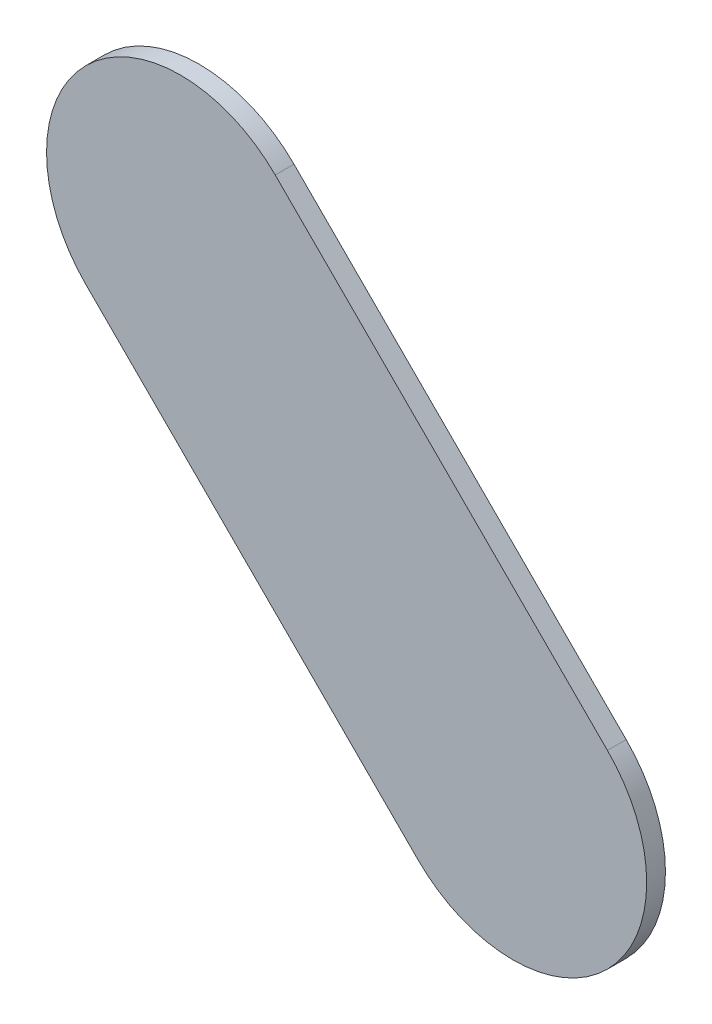
ISO-10303-21;
HEADER;
FILE_DESCRIPTION(('STEP AP214'),'2;1');
FILE_NAME('part.step','',(''),(''),'','','');
FILE_SCHEMA(('AUTOMOTIVE_DESIGN { 1 0 10303 214 1 1 1 1 }'));
ENDSEC;
DATA;
#1=APPLICATION_CONTEXT('core data for automotive mechanical design processes');
#2=APPLICATION_PROTOCOL_DEFINITION('international standard','automotive_design',2000,#1);
#3=PRODUCT_CONTEXT('',#1,'mechanical');
#4=PRODUCT('Part','Part','',(#3));
#5=PRODUCT_RELATED_PRODUCT_CATEGORY('part','',(#4));
#6=PRODUCT_DEFINITION_FORMATION('','',#4);
#7=PRODUCT_DEFINITION_CONTEXT('part definition',#1,'design');
#8=PRODUCT_DEFINITION('design','',#6,#7);
#9=PRODUCT_DEFINITION_SHAPE('','',#8);
#10=(LENGTH_UNIT() NAMED_UNIT(*) SI_UNIT(.MILLI.,.METRE.));
#11=(NAMED_UNIT(*) PLANE_ANGLE_UNIT() SI_UNIT($,.RADIAN.));
#12=(NAMED_UNIT(*) SI_UNIT($,.STERADIAN.) SOLID_ANGLE_UNIT());
#13=UNCERTAINTY_MEASURE_WITH_UNIT(LENGTH_MEASURE(1.E-05),#10,'distance_accuracy_value','');
#14=(GEOMETRIC_REPRESENTATION_CONTEXT(3) GLOBAL_UNCERTAINTY_ASSIGNED_CONTEXT((#13)) GLOBAL_UNIT_ASSIGNED_CONTEXT((#10,
#11,#12)) REPRESENTATION_CONTEXT('',''));
#15=CARTESIAN_POINT('',(0.,0.,0.));
#16=DIRECTION('',(0.,0.,1.));
#17=DIRECTION('',(1.,0.,0.));
#18=AXIS2_PLACEMENT_3D('',#15,#16,#17);
#19=CARTESIAN_POINT('',(78.866776,-110.573223,1.635));
#20=DIRECTION('',(0.,0.,1.));
#21=DIRECTION('',(1.,0.,0.));
#22=AXIS2_PLACEMENT_3D('',#19,#20,#21);
#23=PLANE('',#22);
#24=DIRECTION('',(-0.707106781186548,0.707106781186548,0.));
#25=VECTOR('',#24,1.);
#26=CARTESIAN_POINT('',(78.866776,-110.573223,1.635));
#27=LINE('',#26,#25);
#28=CARTESIAN_POINT('',(78.866776,-110.573223,1.635));
#29=VERTEX_POINT('',#28);
#30=CARTESIAN_POINT('',(78.246776,-109.953223,1.635));
#31=VERTEX_POINT('',#30);
#32=EDGE_CURVE('E82',#29,#31,#27,.T.);
#33=ORIENTED_EDGE('',*,*,#32,.T.);
#34=CARTESIAN_POINT('',(78.0699995,-110.1299995,1.635));
#35=DIRECTION('',(0.,0.,1.));
#36=DIRECTION('',(0.707106781186548,0.707106781186548,0.));
#37=AXIS2_PLACEMENT_3D('',#34,#35,#36);
#38=CIRCLE('',#37,0.249999723809);
#39=CARTESIAN_POINT('',(77.893223,-110.306776,1.635));
#40=VERTEX_POINT('',#39);
#41=EDGE_CURVE('E100',#31,#40,#38,.T.);
#42=ORIENTED_EDGE('',*,*,#41,.T.);
#43=DIRECTION('',(0.707106781186548,-0.707106781186548,0.));
#44=VECTOR('',#43,1.);
#45=CARTESIAN_POINT('',(77.893223,-110.306776,1.635));
#46=LINE('',#45,#44);
#47=CARTESIAN_POINT('',(78.513223,-110.926776,1.635));
#48=VERTEX_POINT('',#47);
#49=EDGE_CURVE('E74',#40,#48,#46,.T.);
#50=ORIENTED_EDGE('',*,*,#49,.T.);
#51=CARTESIAN_POINT('',(78.6899995,-110.7499995,1.635));
#52=DIRECTION('',(0.,0.,1.));
#53=DIRECTION('',(-0.707106781186548,-0.707106781186548,0.));
#54=AXIS2_PLACEMENT_3D('',#51,#52,#53);
#55=CIRCLE('',#54,0.249999723809);
#56=EDGE_CURVE('E11',#48,#29,#55,.T.);
#57=ORIENTED_EDGE('',*,*,#56,.T.);
#58=EDGE_LOOP('',(#33,#42,#50,#57));
#59=FACE_BOUND('',#58,.T.);
#60=ADVANCED_FACE('F17',(#59),#23,.T.);
#61=CARTESIAN_POINT('',(78.866776,-110.573223,1.6));
#62=DIRECTION('',(0.,0.,1.));
#63=DIRECTION('',(1.,0.,0.));
#64=AXIS2_PLACEMENT_3D('',#61,#62,#63);
#65=PLANE('',#64);
#66=CARTESIAN_POINT('',(78.6899995,-110.7499995,1.6));
#67=DIRECTION('',(0.,0.,1.));
#68=DIRECTION('',(-0.707106781186548,-0.707106781186548,0.));
#69=AXIS2_PLACEMENT_3D('',#66,#67,#68);
#70=CIRCLE('',#69,0.249999723809);
#71=CARTESIAN_POINT('',(78.513223,-110.926776,1.6));
#72=VERTEX_POINT('',#71);
#73=CARTESIAN_POINT('',(78.866776,-110.573223,1.6));
#74=VERTEX_POINT('',#73);
#75=EDGE_CURVE('E25',#72,#74,#70,.T.);
#76=ORIENTED_EDGE('',*,*,#75,.F.);
#77=DIRECTION('',(0.707106781186548,-0.707106781186548,0.));
#78=VECTOR('',#77,1.);
#79=CARTESIAN_POINT('',(77.893223,-110.306776,1.6));
#80=LINE('',#79,#78);
#81=CARTESIAN_POINT('',(77.893223,-110.306776,1.6));
#82=VERTEX_POINT('',#81);
#83=EDGE_CURVE('E104',#82,#72,#80,.T.);
#84=ORIENTED_EDGE('',*,*,#83,.F.);
#85=CARTESIAN_POINT('',(78.0699995,-110.1299995,1.6));
#86=DIRECTION('',(0.,0.,1.));
#87=DIRECTION('',(0.707106781186548,0.707106781186548,0.));
#88=AXIS2_PLACEMENT_3D('',#85,#86,#87);
#89=CIRCLE('',#88,0.249999723809);
#90=CARTESIAN_POINT('',(78.246776,-109.953223,1.6));
#91=VERTEX_POINT('',#90);
#92=EDGE_CURVE('E84',#91,#82,#89,.T.);
#93=ORIENTED_EDGE('',*,*,#92,.F.);
#94=DIRECTION('',(-0.707106781186548,0.707106781186548,0.));
#95=VECTOR('',#94,1.);
#96=CARTESIAN_POINT('',(78.866776,-110.573223,1.6));
#97=LINE('',#96,#95);
#98=EDGE_CURVE('E80',#74,#91,#97,.T.);
#99=ORIENTED_EDGE('',*,*,#98,.F.);
#100=EDGE_LOOP('',(#76,#84,#93,#99));
#101=FACE_BOUND('',#100,.T.);
#102=ADVANCED_FACE('F86',(#101),#65,.F.);
#103=CARTESIAN_POINT('',(78.6899995,-110.7499995,1.6));
#104=DIRECTION('',(0.,0.,-1.));
#105=DIRECTION('',(-0.707106781186548,-0.707106781186548,0.));
#106=AXIS2_PLACEMENT_3D('',#103,#104,#105);
#107=CYLINDRICAL_SURFACE('',#106,0.249999723809);
#108=ORIENTED_EDGE('',*,*,#75,.T.);
#109=DIRECTION('',(0.,0.,1.));
#110=VECTOR('',#109,1.);
#111=CARTESIAN_POINT('',(78.866776,-110.573223,1.6));
#112=LINE('',#111,#110);
#113=EDGE_CURVE('E68',#74,#29,#112,.T.);
#114=ORIENTED_EDGE('',*,*,#113,.T.);
#115=ORIENTED_EDGE('',*,*,#56,.F.);
#116=DIRECTION('',(0.,0.,1.));
#117=VECTOR('',#116,1.);
#118=CARTESIAN_POINT('',(78.513223,-110.926776,1.6));
#119=LINE('',#118,#117);
#120=EDGE_CURVE('E71',#72,#48,#119,.T.);
#121=ORIENTED_EDGE('',*,*,#120,.F.);
#122=EDGE_LOOP('',(#108,#114,#115,#121));
#123=FACE_BOUND('',#122,.T.);
#124=ADVANCED_FACE('F67',(#123),#107,.T.);
#125=CARTESIAN_POINT('',(77.893223,-110.306776,1.6));
#126=DIRECTION('',(0.707106781186548,0.707106781186548,0.));
#127=DIRECTION('',(0.,0.,-1.));
#128=AXIS2_PLACEMENT_3D('',#125,#126,#127);
#129=PLANE('',#128);
#130=ORIENTED_EDGE('',*,*,#83,.T.);
#131=ORIENTED_EDGE('',*,*,#120,.T.);
#132=ORIENTED_EDGE('',*,*,#49,.F.);
#133=DIRECTION('',(0.,0.,1.));
#134=VECTOR('',#133,1.);
#135=CARTESIAN_POINT('',(77.893223,-110.306776,1.6));
#136=LINE('',#135,#134);
#137=EDGE_CURVE('E105',#82,#40,#136,.T.);
#138=ORIENTED_EDGE('',*,*,#137,.F.);
#139=EDGE_LOOP('',(#130,#131,#132,#138));
#140=FACE_BOUND('',#139,.T.);
#141=ADVANCED_FACE('F120',(#140),#129,.F.);
#142=CARTESIAN_POINT('',(78.0699995,-110.1299995,1.6));
#143=DIRECTION('',(0.,0.,-1.));
#144=DIRECTION('',(0.707106781186548,0.707106781186548,0.));
#145=AXIS2_PLACEMENT_3D('',#142,#143,#144);
#146=CYLINDRICAL_SURFACE('',#145,0.249999723809);
#147=ORIENTED_EDGE('',*,*,#92,.T.);
#148=ORIENTED_EDGE('',*,*,#137,.T.);
#149=ORIENTED_EDGE('',*,*,#41,.F.);
#150=DIRECTION('',(0.,0.,1.));
#151=VECTOR('',#150,1.);
#152=CARTESIAN_POINT('',(78.246776,-109.953223,1.6));
#153=LINE('',#152,#151);
#154=EDGE_CURVE('E90',#91,#31,#153,.T.);
#155=ORIENTED_EDGE('',*,*,#154,.F.);
#156=EDGE_LOOP('',(#147,#148,#149,#155));
#157=FACE_BOUND('',#156,.T.);
#158=ADVANCED_FACE('F122',(#157),#146,.T.);
#159=CARTESIAN_POINT('',(78.866776,-110.573223,1.6));
#160=DIRECTION('',(-0.707106781186548,-0.707106781186548,0.));
#161=DIRECTION('',(-0.707106781186548,0.707106781186548,0.));
#162=AXIS2_PLACEMENT_3D('',#159,#160,#161);
#163=PLANE('',#162);
#164=ORIENTED_EDGE('',*,*,#98,.T.);
#165=ORIENTED_EDGE('',*,*,#154,.T.);
#166=ORIENTED_EDGE('',*,*,#32,.F.);
#167=ORIENTED_EDGE('',*,*,#113,.F.);
#168=EDGE_LOOP('',(#164,#165,#166,#167));
#169=FACE_BOUND('',#168,.T.);
#170=ADVANCED_FACE('F78',(#169),#163,.F.);
#171=CLOSED_SHELL('',(#60,#102,#124,#141,#158,#170));
#172=MANIFOLD_SOLID_BREP('B1',#171);
#173=ADVANCED_BREP_SHAPE_REPRESENTATION('',(#18,#172),#14);
#174=SHAPE_DEFINITION_REPRESENTATION(#9,#173);
ENDSEC;
END-ISO-10303-21;
